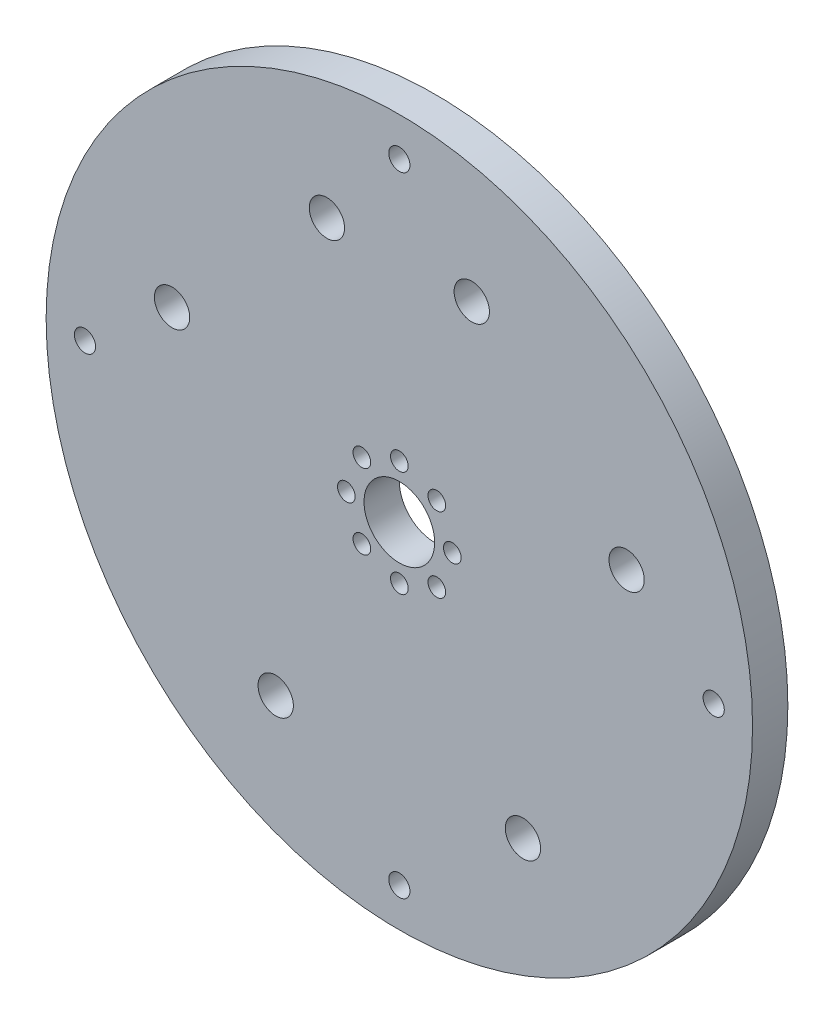
ISO-10303-21;
HEADER;
FILE_DESCRIPTION(('STEP AP214'),'2;1');
FILE_NAME('part.step','',(''),(''),'','','');
FILE_SCHEMA(('AUTOMOTIVE_DESIGN { 1 0 10303 214 1 1 1 1 }'));
ENDSEC;
DATA;
#1=APPLICATION_CONTEXT('core data for automotive mechanical design processes');
#2=APPLICATION_PROTOCOL_DEFINITION('international standard','automotive_design',2000,#1);
#3=PRODUCT_CONTEXT('',#1,'mechanical');
#4=PRODUCT('Part','Part','',(#3));
#5=PRODUCT_RELATED_PRODUCT_CATEGORY('part','',(#4));
#6=PRODUCT_DEFINITION_FORMATION('','',#4);
#7=PRODUCT_DEFINITION_CONTEXT('part definition',#1,'design');
#8=PRODUCT_DEFINITION('design','',#6,#7);
#9=PRODUCT_DEFINITION_SHAPE('','',#8);
#10=(LENGTH_UNIT() NAMED_UNIT(*) SI_UNIT(.MILLI.,.METRE.));
#11=(NAMED_UNIT(*) PLANE_ANGLE_UNIT() SI_UNIT($,.RADIAN.));
#12=(NAMED_UNIT(*) SI_UNIT($,.STERADIAN.) SOLID_ANGLE_UNIT());
#13=UNCERTAINTY_MEASURE_WITH_UNIT(LENGTH_MEASURE(1.E-05),#10,'distance_accuracy_value','');
#14=(GEOMETRIC_REPRESENTATION_CONTEXT(3) GLOBAL_UNCERTAINTY_ASSIGNED_CONTEXT((#13)) GLOBAL_UNIT_ASSIGNED_CONTEXT((#10,
#11,#12)) REPRESENTATION_CONTEXT('',''));
#15=CARTESIAN_POINT('',(0.,0.,0.));
#16=DIRECTION('',(0.,0.,1.));
#17=DIRECTION('',(1.,0.,0.));
#18=AXIS2_PLACEMENT_3D('',#15,#16,#17);
#19=CARTESIAN_POINT('',(0.,0.,5.));
#20=DIRECTION('',(0.,0.,1.));
#21=DIRECTION('',(1.,0.,0.));
#22=AXIS2_PLACEMENT_3D('',#19,#20,#21);
#23=PLANE('',#22);
#24=CARTESIAN_POINT('',(-17.5,-30.,5.));
#25=DIRECTION('',(0.,0.,1.));
#26=DIRECTION('',(1.,0.,0.));
#27=AXIS2_PLACEMENT_3D('',#24,#25,#26);
#28=CIRCLE('',#27,2.5);
#29=CARTESIAN_POINT('',(-15.,-30.,5.));
#30=VERTEX_POINT('',#29);
#31=EDGE_CURVE('E152',#30,#30,#28,.T.);
#32=ORIENTED_EDGE('',*,*,#31,.F.);
#33=EDGE_LOOP('',(#32));
#34=FACE_BOUND('',#33,.T.);
#35=CARTESIAN_POINT('',(10.2530483272049,32.1733585439879,5.));
#36=DIRECTION('',(0.,0.,1.));
#37=DIRECTION('',(-1.,0.,0.));
#38=AXIS2_PLACEMENT_3D('',#35,#36,#37);
#39=CIRCLE('',#38,2.5);
#40=CARTESIAN_POINT('',(7.75304832720494,32.1733585439879,5.));
#41=VERTEX_POINT('',#40);
#42=EDGE_CURVE('E140',#41,#41,#39,.T.);
#43=ORIENTED_EDGE('',*,*,#42,.F.);
#44=EDGE_LOOP('',(#43));
#45=FACE_BOUND('',#44,.T.);
#46=CARTESIAN_POINT('',(-10.2530483272049,32.1733585439879,5.));
#47=DIRECTION('',(0.,0.,1.));
#48=DIRECTION('',(1.,0.,0.));
#49=AXIS2_PLACEMENT_3D('',#46,#47,#48);
#50=CIRCLE('',#49,2.5);
#51=CARTESIAN_POINT('',(-7.75304832720494,32.1733585439879,5.));
#52=VERTEX_POINT('',#51);
#53=EDGE_CURVE('E128',#52,#52,#50,.T.);
#54=ORIENTED_EDGE('',*,*,#53,.F.);
#55=EDGE_LOOP('',(#54));
#56=FACE_BOUND('',#55,.T.);
#57=CARTESIAN_POINT('',(-7.5,0.,5.));
#58=DIRECTION('',(0.,0.,1.));
#59=DIRECTION('',(1.,0.,0.));
#60=AXIS2_PLACEMENT_3D('',#57,#58,#59);
#61=CIRCLE('',#60,1.25);
#62=CARTESIAN_POINT('',(-6.25,0.,5.));
#63=VERTEX_POINT('',#62);
#64=EDGE_CURVE('E116',#63,#63,#61,.T.);
#65=ORIENTED_EDGE('',*,*,#64,.F.);
#66=EDGE_LOOP('',(#65));
#67=FACE_BOUND('',#66,.T.);
#68=CARTESIAN_POINT('',(1.2762214690701E-12,-7.5,5.));
#69=DIRECTION('',(0.,0.,1.));
#70=DIRECTION('',(1.,0.,0.));
#71=AXIS2_PLACEMENT_3D('',#68,#69,#70);
#72=CIRCLE('',#71,1.25000000000127);
#73=CARTESIAN_POINT('',(1.25000000000255,-7.5,5.));
#74=VERTEX_POINT('',#73);
#75=EDGE_CURVE('E104',#74,#74,#72,.T.);
#76=ORIENTED_EDGE('',*,*,#75,.F.);
#77=EDGE_LOOP('',(#76));
#78=FACE_BOUND('',#77,.T.);
#79=CARTESIAN_POINT('',(7.5,0.,5.));
#80=DIRECTION('',(0.,0.,1.));
#81=DIRECTION('',(1.,0.,0.));
#82=AXIS2_PLACEMENT_3D('',#79,#80,#81);
#83=CIRCLE('',#82,1.25);
#84=CARTESIAN_POINT('',(8.75,0.,5.));
#85=VERTEX_POINT('',#84);
#86=EDGE_CURVE('E92',#85,#85,#83,.T.);
#87=ORIENTED_EDGE('',*,*,#86,.F.);
#88=EDGE_LOOP('',(#87));
#89=FACE_BOUND('',#88,.T.);
#90=CARTESIAN_POINT('',(0.,0.,5.));
#91=DIRECTION('',(0.,0.,1.));
#92=DIRECTION('',(1.,0.,0.));
#93=AXIS2_PLACEMENT_3D('',#90,#91,#92);
#94=CIRCLE('',#93,5.);
#95=CARTESIAN_POINT('',(5.,0.,5.));
#96=VERTEX_POINT('',#95);
#97=EDGE_CURVE('E80',#96,#96,#94,.T.);
#98=ORIENTED_EDGE('',*,*,#97,.F.);
#99=EDGE_LOOP('',(#98));
#100=FACE_BOUND('',#99,.T.);
#101=CARTESIAN_POINT('',(2.51318310453734E-12,-44.5,5.));
#102=DIRECTION('',(0.,0.,1.));
#103=DIRECTION('',(1.,0.,0.));
#104=AXIS2_PLACEMENT_3D('',#101,#102,#103);
#105=CIRCLE('',#104,1.5000000000027);
#106=CARTESIAN_POINT('',(1.50000000000522,-44.5,5.));
#107=VERTEX_POINT('',#106);
#108=EDGE_CURVE('E68',#107,#107,#105,.T.);
#109=ORIENTED_EDGE('',*,*,#108,.F.);
#110=EDGE_LOOP('',(#109));
#111=FACE_BOUND('',#110,.T.);
#112=CARTESIAN_POINT('',(0.,7.5,5.));
#113=DIRECTION('',(0.,0.,1.));
#114=DIRECTION('',(1.,0.,0.));
#115=AXIS2_PLACEMENT_3D('',#112,#113,#114);
#116=CIRCLE('',#115,1.25);
#117=CARTESIAN_POINT('',(1.25,7.5,5.));
#118=VERTEX_POINT('',#117);
#119=EDGE_CURVE('E56',#118,#118,#116,.T.);
#120=ORIENTED_EDGE('',*,*,#119,.F.);
#121=EDGE_LOOP('',(#120));
#122=FACE_BOUND('',#121,.T.);
#123=CARTESIAN_POINT('',(0.,0.,5.));
#124=DIRECTION('',(0.,0.,1.));
#125=DIRECTION('',(1.,0.,0.));
#126=AXIS2_PLACEMENT_3D('',#123,#124,#125);
#127=CIRCLE('',#126,50.);
#128=CARTESIAN_POINT('',(50.,0.,5.));
#129=VERTEX_POINT('',#128);
#130=EDGE_CURVE('E10',#129,#129,#127,.T.);
#131=ORIENTED_EDGE('',*,*,#130,.T.);
#132=EDGE_LOOP('',(#131));
#133=FACE_BOUND('',#132,.T.);
#134=CARTESIAN_POINT('',(0.,44.5,5.));
#135=DIRECTION('',(0.,0.,1.));
#136=DIRECTION('',(1.,0.,0.));
#137=AXIS2_PLACEMENT_3D('',#134,#135,#136);
#138=CIRCLE('',#137,1.5);
#139=CARTESIAN_POINT('',(1.5,44.5,5.));
#140=VERTEX_POINT('',#139);
#141=EDGE_CURVE('E51',#140,#140,#138,.T.);
#142=ORIENTED_EDGE('',*,*,#141,.F.);
#143=EDGE_LOOP('',(#142));
#144=FACE_BOUND('',#143,.T.);
#145=CARTESIAN_POINT('',(44.5000000000012,1.25659155226867E-12,5.));
#146=DIRECTION('',(0.,0.,1.));
#147=DIRECTION('',(1.,0.,0.));
#148=AXIS2_PLACEMENT_3D('',#145,#146,#147);
#149=CIRCLE('',#148,1.50000000000099);
#150=CARTESIAN_POINT('',(46.0000000000022,1.25659155226867E-12,5.));
#151=VERTEX_POINT('',#150);
#152=EDGE_CURVE('E62',#151,#151,#149,.T.);
#153=ORIENTED_EDGE('',*,*,#152,.F.);
#154=EDGE_LOOP('',(#153));
#155=FACE_BOUND('',#154,.T.);
#156=CARTESIAN_POINT('',(-44.4999999999987,-1.26204123052488E-12,5.));
#157=DIRECTION('',(0.,0.,1.));
#158=DIRECTION('',(1.,0.,0.));
#159=AXIS2_PLACEMENT_3D('',#156,#157,#158);
#160=CIRCLE('',#159,1.50000000000202);
#161=CARTESIAN_POINT('',(-42.9999999999967,-1.26204123052488E-12,5.));
#162=VERTEX_POINT('',#161);
#163=EDGE_CURVE('E74',#162,#162,#160,.T.);
#164=ORIENTED_EDGE('',*,*,#163,.F.);
#165=EDGE_LOOP('',(#164));
#166=FACE_BOUND('',#165,.T.);
#167=CARTESIAN_POINT('',(5.30330085889912,5.3033008588991,5.));
#168=DIRECTION('',(0.,0.,1.));
#169=DIRECTION('',(1.,0.,0.));
#170=AXIS2_PLACEMENT_3D('',#167,#168,#169);
#171=CIRCLE('',#170,1.25);
#172=CARTESIAN_POINT('',(6.55330085889912,5.3033008588991,5.));
#173=VERTEX_POINT('',#172);
#174=EDGE_CURVE('E86',#173,#173,#171,.T.);
#175=ORIENTED_EDGE('',*,*,#174,.F.);
#176=EDGE_LOOP('',(#175));
#177=FACE_BOUND('',#176,.T.);
#178=CARTESIAN_POINT('',(5.3033008589002,-5.30330085889865,5.));
#179=DIRECTION('',(0.,0.,1.));
#180=DIRECTION('',(1.,0.,0.));
#181=AXIS2_PLACEMENT_3D('',#178,#179,#180);
#182=CIRCLE('',#181,1.25000000000095);
#183=CARTESIAN_POINT('',(6.55330085890114,-5.30330085889865,5.));
#184=VERTEX_POINT('',#183);
#185=EDGE_CURVE('E98',#184,#184,#182,.T.);
#186=ORIENTED_EDGE('',*,*,#185,.F.);
#187=EDGE_LOOP('',(#186));
#188=FACE_BOUND('',#187,.T.);
#189=CARTESIAN_POINT('',(-5.30330085889802,-5.30330085889956,5.));
#190=DIRECTION('',(0.,0.,1.));
#191=DIRECTION('',(1.,0.,0.));
#192=AXIS2_PLACEMENT_3D('',#189,#190,#191);
#193=CIRCLE('',#192,1.25000000000124);
#194=CARTESIAN_POINT('',(-4.05330085889678,-5.30330085889956,5.));
#195=VERTEX_POINT('',#194);
#196=EDGE_CURVE('E110',#195,#195,#193,.T.);
#197=ORIENTED_EDGE('',*,*,#196,.F.);
#198=EDGE_LOOP('',(#197));
#199=FACE_BOUND('',#198,.T.);
#200=CARTESIAN_POINT('',(-5.30330085889904,5.30330085889917,5.));
#201=DIRECTION('',(0.,0.,1.));
#202=DIRECTION('',(1.,0.,0.));
#203=AXIS2_PLACEMENT_3D('',#200,#201,#202);
#204=CIRCLE('',#203,1.25);
#205=CARTESIAN_POINT('',(-4.05330085889904,5.30330085889917,5.));
#206=VERTEX_POINT('',#205);
#207=EDGE_CURVE('E122',#206,#206,#204,.T.);
#208=ORIENTED_EDGE('',*,*,#207,.F.);
#209=EDGE_LOOP('',(#208));
#210=FACE_BOUND('',#209,.T.);
#211=CARTESIAN_POINT('',(-32.1733585439879,10.2530483272049,5.));
#212=DIRECTION('',(0.,0.,1.));
#213=DIRECTION('',(1.,0.,0.));
#214=AXIS2_PLACEMENT_3D('',#211,#212,#213);
#215=CIRCLE('',#214,2.5);
#216=CARTESIAN_POINT('',(-29.6733585439879,10.2530483272049,5.));
#217=VERTEX_POINT('',#216);
#218=EDGE_CURVE('E134',#217,#217,#215,.T.);
#219=ORIENTED_EDGE('',*,*,#218,.F.);
#220=EDGE_LOOP('',(#219));
#221=FACE_BOUND('',#220,.T.);
#222=CARTESIAN_POINT('',(32.1733585439879,10.2530483272049,5.));
#223=DIRECTION('',(0.,0.,1.));
#224=DIRECTION('',(-1.,0.,0.));
#225=AXIS2_PLACEMENT_3D('',#222,#223,#224);
#226=CIRCLE('',#225,2.5);
#227=CARTESIAN_POINT('',(29.6733585439879,10.2530483272049,5.));
#228=VERTEX_POINT('',#227);
#229=EDGE_CURVE('E146',#228,#228,#226,.T.);
#230=ORIENTED_EDGE('',*,*,#229,.F.);
#231=EDGE_LOOP('',(#230));
#232=FACE_BOUND('',#231,.T.);
#233=CARTESIAN_POINT('',(17.5,-30.,5.));
#234=DIRECTION('',(0.,0.,1.));
#235=DIRECTION('',(1.,0.,0.));
#236=AXIS2_PLACEMENT_3D('',#233,#234,#235);
#237=CIRCLE('',#236,2.5);
#238=CARTESIAN_POINT('',(20.,-30.,5.));
#239=VERTEX_POINT('',#238);
#240=EDGE_CURVE('E158',#239,#239,#237,.T.);
#241=ORIENTED_EDGE('',*,*,#240,.F.);
#242=EDGE_LOOP('',(#241));
#243=FACE_BOUND('',#242,.T.);
#244=ADVANCED_FACE('F40',(#34,#45,#56,#67,#78,#89,#100,#111,#122,#133,#144,#155,#166,#177,#188,
#199,#210,#221,#232,#243),#23,.T.);
#245=CARTESIAN_POINT('',(0.,0.,0.));
#246=DIRECTION('',(0.,0.,1.));
#247=DIRECTION('',(1.,0.,0.));
#248=AXIS2_PLACEMENT_3D('',#245,#246,#247);
#249=PLANE('',#248);
#250=CARTESIAN_POINT('',(0.,0.,0.));
#251=DIRECTION('',(0.,0.,1.));
#252=DIRECTION('',(1.,0.,0.));
#253=AXIS2_PLACEMENT_3D('',#250,#251,#252);
#254=CIRCLE('',#253,50.);
#255=CARTESIAN_POINT('',(50.,0.,0.));
#256=VERTEX_POINT('',#255);
#257=EDGE_CURVE('E44',#256,#256,#254,.T.);
#258=ORIENTED_EDGE('',*,*,#257,.F.);
#259=EDGE_LOOP('',(#258));
#260=FACE_BOUND('',#259,.T.);
#261=CARTESIAN_POINT('',(0.,44.5,0.));
#262=DIRECTION('',(0.,0.,1.));
#263=DIRECTION('',(1.,0.,0.));
#264=AXIS2_PLACEMENT_3D('',#261,#262,#263);
#265=CIRCLE('',#264,1.5);
#266=CARTESIAN_POINT('',(1.5,44.5,0.));
#267=VERTEX_POINT('',#266);
#268=EDGE_CURVE('E53',#267,#267,#265,.T.);
#269=ORIENTED_EDGE('',*,*,#268,.T.);
#270=EDGE_LOOP('',(#269));
#271=FACE_BOUND('',#270,.T.);
#272=CARTESIAN_POINT('',(0.,7.5,0.));
#273=DIRECTION('',(0.,0.,1.));
#274=DIRECTION('',(1.,0.,0.));
#275=AXIS2_PLACEMENT_3D('',#272,#273,#274);
#276=CIRCLE('',#275,1.25);
#277=CARTESIAN_POINT('',(1.25,7.5,0.));
#278=VERTEX_POINT('',#277);
#279=EDGE_CURVE('E59',#278,#278,#276,.T.);
#280=ORIENTED_EDGE('',*,*,#279,.T.);
#281=EDGE_LOOP('',(#280));
#282=FACE_BOUND('',#281,.T.);
#283=CARTESIAN_POINT('',(44.5000000000012,1.25659155226867E-12,0.));
#284=DIRECTION('',(0.,0.,1.));
#285=DIRECTION('',(1.,0.,0.));
#286=AXIS2_PLACEMENT_3D('',#283,#284,#285);
#287=CIRCLE('',#286,1.50000000000099);
#288=CARTESIAN_POINT('',(46.0000000000022,1.25659155226867E-12,0.));
#289=VERTEX_POINT('',#288);
#290=EDGE_CURVE('E65',#289,#289,#287,.T.);
#291=ORIENTED_EDGE('',*,*,#290,.T.);
#292=EDGE_LOOP('',(#291));
#293=FACE_BOUND('',#292,.T.);
#294=CARTESIAN_POINT('',(2.51318310453734E-12,-44.5,0.));
#295=DIRECTION('',(0.,0.,1.));
#296=DIRECTION('',(1.,0.,0.));
#297=AXIS2_PLACEMENT_3D('',#294,#295,#296);
#298=CIRCLE('',#297,1.5000000000027);
#299=CARTESIAN_POINT('',(1.50000000000522,-44.5,0.));
#300=VERTEX_POINT('',#299);
#301=EDGE_CURVE('E71',#300,#300,#298,.T.);
#302=ORIENTED_EDGE('',*,*,#301,.T.);
#303=EDGE_LOOP('',(#302));
#304=FACE_BOUND('',#303,.T.);
#305=CARTESIAN_POINT('',(-44.4999999999987,-1.26204123052488E-12,0.));
#306=DIRECTION('',(0.,0.,1.));
#307=DIRECTION('',(1.,0.,0.));
#308=AXIS2_PLACEMENT_3D('',#305,#306,#307);
#309=CIRCLE('',#308,1.50000000000202);
#310=CARTESIAN_POINT('',(-42.9999999999967,-1.26204123052488E-12,0.));
#311=VERTEX_POINT('',#310);
#312=EDGE_CURVE('E77',#311,#311,#309,.T.);
#313=ORIENTED_EDGE('',*,*,#312,.T.);
#314=EDGE_LOOP('',(#313));
#315=FACE_BOUND('',#314,.T.);
#316=CARTESIAN_POINT('',(0.,0.,0.));
#317=DIRECTION('',(0.,0.,1.));
#318=DIRECTION('',(1.,0.,0.));
#319=AXIS2_PLACEMENT_3D('',#316,#317,#318);
#320=CIRCLE('',#319,5.);
#321=CARTESIAN_POINT('',(5.,0.,0.));
#322=VERTEX_POINT('',#321);
#323=EDGE_CURVE('E83',#322,#322,#320,.T.);
#324=ORIENTED_EDGE('',*,*,#323,.T.);
#325=EDGE_LOOP('',(#324));
#326=FACE_BOUND('',#325,.T.);
#327=CARTESIAN_POINT('',(5.30330085889912,5.3033008588991,0.));
#328=DIRECTION('',(0.,0.,1.));
#329=DIRECTION('',(1.,0.,0.));
#330=AXIS2_PLACEMENT_3D('',#327,#328,#329);
#331=CIRCLE('',#330,1.25);
#332=CARTESIAN_POINT('',(6.55330085889912,5.3033008588991,0.));
#333=VERTEX_POINT('',#332);
#334=EDGE_CURVE('E89',#333,#333,#331,.T.);
#335=ORIENTED_EDGE('',*,*,#334,.T.);
#336=EDGE_LOOP('',(#335));
#337=FACE_BOUND('',#336,.T.);
#338=CARTESIAN_POINT('',(7.5,0.,0.));
#339=DIRECTION('',(0.,0.,1.));
#340=DIRECTION('',(1.,0.,0.));
#341=AXIS2_PLACEMENT_3D('',#338,#339,#340);
#342=CIRCLE('',#341,1.25);
#343=CARTESIAN_POINT('',(8.75,0.,0.));
#344=VERTEX_POINT('',#343);
#345=EDGE_CURVE('E95',#344,#344,#342,.T.);
#346=ORIENTED_EDGE('',*,*,#345,.T.);
#347=EDGE_LOOP('',(#346));
#348=FACE_BOUND('',#347,.T.);
#349=CARTESIAN_POINT('',(5.3033008589002,-5.30330085889865,0.));
#350=DIRECTION('',(0.,0.,1.));
#351=DIRECTION('',(1.,0.,0.));
#352=AXIS2_PLACEMENT_3D('',#349,#350,#351);
#353=CIRCLE('',#352,1.25000000000095);
#354=CARTESIAN_POINT('',(6.55330085890114,-5.30330085889865,0.));
#355=VERTEX_POINT('',#354);
#356=EDGE_CURVE('E101',#355,#355,#353,.T.);
#357=ORIENTED_EDGE('',*,*,#356,.T.);
#358=EDGE_LOOP('',(#357));
#359=FACE_BOUND('',#358,.T.);
#360=CARTESIAN_POINT('',(1.2762214690701E-12,-7.5,0.));
#361=DIRECTION('',(0.,0.,1.));
#362=DIRECTION('',(1.,0.,0.));
#363=AXIS2_PLACEMENT_3D('',#360,#361,#362);
#364=CIRCLE('',#363,1.25000000000127);
#365=CARTESIAN_POINT('',(1.25000000000255,-7.5,0.));
#366=VERTEX_POINT('',#365);
#367=EDGE_CURVE('E107',#366,#366,#364,.T.);
#368=ORIENTED_EDGE('',*,*,#367,.T.);
#369=EDGE_LOOP('',(#368));
#370=FACE_BOUND('',#369,.T.);
#371=CARTESIAN_POINT('',(-5.30330085889802,-5.30330085889956,0.));
#372=DIRECTION('',(0.,0.,1.));
#373=DIRECTION('',(1.,0.,0.));
#374=AXIS2_PLACEMENT_3D('',#371,#372,#373);
#375=CIRCLE('',#374,1.25000000000124);
#376=CARTESIAN_POINT('',(-4.05330085889678,-5.30330085889956,0.));
#377=VERTEX_POINT('',#376);
#378=EDGE_CURVE('E113',#377,#377,#375,.T.);
#379=ORIENTED_EDGE('',*,*,#378,.T.);
#380=EDGE_LOOP('',(#379));
#381=FACE_BOUND('',#380,.T.);
#382=CARTESIAN_POINT('',(-7.5,0.,0.));
#383=DIRECTION('',(0.,0.,1.));
#384=DIRECTION('',(1.,0.,0.));
#385=AXIS2_PLACEMENT_3D('',#382,#383,#384);
#386=CIRCLE('',#385,1.25);
#387=CARTESIAN_POINT('',(-6.25,0.,0.));
#388=VERTEX_POINT('',#387);
#389=EDGE_CURVE('E119',#388,#388,#386,.T.);
#390=ORIENTED_EDGE('',*,*,#389,.T.);
#391=EDGE_LOOP('',(#390));
#392=FACE_BOUND('',#391,.T.);
#393=CARTESIAN_POINT('',(-5.30330085889904,5.30330085889917,0.));
#394=DIRECTION('',(0.,0.,1.));
#395=DIRECTION('',(1.,0.,0.));
#396=AXIS2_PLACEMENT_3D('',#393,#394,#395);
#397=CIRCLE('',#396,1.25);
#398=CARTESIAN_POINT('',(-4.05330085889904,5.30330085889917,0.));
#399=VERTEX_POINT('',#398);
#400=EDGE_CURVE('E125',#399,#399,#397,.T.);
#401=ORIENTED_EDGE('',*,*,#400,.T.);
#402=EDGE_LOOP('',(#401));
#403=FACE_BOUND('',#402,.T.);
#404=CARTESIAN_POINT('',(-10.2530483272049,32.1733585439879,0.));
#405=DIRECTION('',(0.,0.,1.));
#406=DIRECTION('',(1.,0.,0.));
#407=AXIS2_PLACEMENT_3D('',#404,#405,#406);
#408=CIRCLE('',#407,2.5);
#409=CARTESIAN_POINT('',(-7.75304832720494,32.1733585439879,0.));
#410=VERTEX_POINT('',#409);
#411=EDGE_CURVE('E131',#410,#410,#408,.T.);
#412=ORIENTED_EDGE('',*,*,#411,.T.);
#413=EDGE_LOOP('',(#412));
#414=FACE_BOUND('',#413,.T.);
#415=CARTESIAN_POINT('',(-32.1733585439879,10.2530483272049,0.));
#416=DIRECTION('',(0.,0.,1.));
#417=DIRECTION('',(1.,0.,0.));
#418=AXIS2_PLACEMENT_3D('',#415,#416,#417);
#419=CIRCLE('',#418,2.5);
#420=CARTESIAN_POINT('',(-29.6733585439879,10.2530483272049,0.));
#421=VERTEX_POINT('',#420);
#422=EDGE_CURVE('E137',#421,#421,#419,.T.);
#423=ORIENTED_EDGE('',*,*,#422,.T.);
#424=EDGE_LOOP('',(#423));
#425=FACE_BOUND('',#424,.T.);
#426=CARTESIAN_POINT('',(10.2530483272049,32.1733585439879,0.));
#427=DIRECTION('',(0.,0.,1.));
#428=DIRECTION('',(-1.,0.,0.));
#429=AXIS2_PLACEMENT_3D('',#426,#427,#428);
#430=CIRCLE('',#429,2.5);
#431=CARTESIAN_POINT('',(7.75304832720494,32.1733585439879,0.));
#432=VERTEX_POINT('',#431);
#433=EDGE_CURVE('E143',#432,#432,#430,.T.);
#434=ORIENTED_EDGE('',*,*,#433,.T.);
#435=EDGE_LOOP('',(#434));
#436=FACE_BOUND('',#435,.T.);
#437=CARTESIAN_POINT('',(32.1733585439879,10.2530483272049,0.));
#438=DIRECTION('',(0.,0.,1.));
#439=DIRECTION('',(-1.,0.,0.));
#440=AXIS2_PLACEMENT_3D('',#437,#438,#439);
#441=CIRCLE('',#440,2.5);
#442=CARTESIAN_POINT('',(29.6733585439879,10.2530483272049,0.));
#443=VERTEX_POINT('',#442);
#444=EDGE_CURVE('E149',#443,#443,#441,.T.);
#445=ORIENTED_EDGE('',*,*,#444,.T.);
#446=EDGE_LOOP('',(#445));
#447=FACE_BOUND('',#446,.T.);
#448=CARTESIAN_POINT('',(-17.5,-30.,0.));
#449=DIRECTION('',(0.,0.,1.));
#450=DIRECTION('',(1.,0.,0.));
#451=AXIS2_PLACEMENT_3D('',#448,#449,#450);
#452=CIRCLE('',#451,2.5);
#453=CARTESIAN_POINT('',(-15.,-30.,0.));
#454=VERTEX_POINT('',#453);
#455=EDGE_CURVE('E155',#454,#454,#452,.T.);
#456=ORIENTED_EDGE('',*,*,#455,.T.);
#457=EDGE_LOOP('',(#456));
#458=FACE_BOUND('',#457,.T.);
#459=CARTESIAN_POINT('',(17.5,-30.,0.));
#460=DIRECTION('',(0.,0.,1.));
#461=DIRECTION('',(1.,0.,0.));
#462=AXIS2_PLACEMENT_3D('',#459,#460,#461);
#463=CIRCLE('',#462,2.5);
#464=CARTESIAN_POINT('',(20.,-30.,0.));
#465=VERTEX_POINT('',#464);
#466=EDGE_CURVE('E161',#465,#465,#463,.T.);
#467=ORIENTED_EDGE('',*,*,#466,.T.);
#468=EDGE_LOOP('',(#467));
#469=FACE_BOUND('',#468,.T.);
#470=ADVANCED_FACE('F171',(#260,#271,#282,#293,#304,#315,#326,#337,#348,#359,#370,#381,#392,
#403,#414,#425,#436,#447,#458,#469),#249,.F.);
#471=CARTESIAN_POINT('',(0.,0.,5.));
#472=DIRECTION('',(0.,0.,-1.));
#473=DIRECTION('',(-1.,0.,0.));
#474=AXIS2_PLACEMENT_3D('',#471,#472,#473);
#475=CYLINDRICAL_SURFACE('',#474,50.);
#476=ORIENTED_EDGE('',*,*,#130,.F.);
#477=EDGE_LOOP('',(#476));
#478=FACE_BOUND('',#477,.T.);
#479=ORIENTED_EDGE('',*,*,#257,.T.);
#480=EDGE_LOOP('',(#479));
#481=FACE_BOUND('',#480,.T.);
#482=ADVANCED_FACE('F42',(#478,#481),#475,.T.);
#483=CARTESIAN_POINT('',(0.,44.5,5.));
#484=DIRECTION('',(0.,0.,-1.));
#485=DIRECTION('',(-1.,0.,0.));
#486=AXIS2_PLACEMENT_3D('',#483,#484,#485);
#487=CYLINDRICAL_SURFACE('',#486,1.5);
#488=ORIENTED_EDGE('',*,*,#141,.T.);
#489=EDGE_LOOP('',(#488));
#490=FACE_BOUND('',#489,.T.);
#491=ORIENTED_EDGE('',*,*,#268,.F.);
#492=EDGE_LOOP('',(#491));
#493=FACE_BOUND('',#492,.T.);
#494=ADVANCED_FACE('F181',(#490,#493),#487,.F.);
#495=CARTESIAN_POINT('',(0.,7.5,5.));
#496=DIRECTION('',(0.,0.,-1.));
#497=DIRECTION('',(-1.,0.,0.));
#498=AXIS2_PLACEMENT_3D('',#495,#496,#497);
#499=CYLINDRICAL_SURFACE('',#498,1.25);
#500=ORIENTED_EDGE('',*,*,#119,.T.);
#501=EDGE_LOOP('',(#500));
#502=FACE_BOUND('',#501,.T.);
#503=ORIENTED_EDGE('',*,*,#279,.F.);
#504=EDGE_LOOP('',(#503));
#505=FACE_BOUND('',#504,.T.);
#506=ADVANCED_FACE('F184',(#502,#505),#499,.F.);
#507=CARTESIAN_POINT('',(44.5000000000012,1.25659155226867E-12,5.));
#508=DIRECTION('',(0.,0.,-1.));
#509=DIRECTION('',(-1.,0.,0.));
#510=AXIS2_PLACEMENT_3D('',#507,#508,#509);
#511=CYLINDRICAL_SURFACE('',#510,1.50000000000099);
#512=ORIENTED_EDGE('',*,*,#152,.T.);
#513=EDGE_LOOP('',(#512));
#514=FACE_BOUND('',#513,.T.);
#515=ORIENTED_EDGE('',*,*,#290,.F.);
#516=EDGE_LOOP('',(#515));
#517=FACE_BOUND('',#516,.T.);
#518=ADVANCED_FACE('F188',(#514,#517),#511,.F.);
#519=CARTESIAN_POINT('',(2.51318310453734E-12,-44.5,5.));
#520=DIRECTION('',(0.,0.,-1.));
#521=DIRECTION('',(-1.,0.,0.));
#522=AXIS2_PLACEMENT_3D('',#519,#520,#521);
#523=CYLINDRICAL_SURFACE('',#522,1.5000000000027);
#524=ORIENTED_EDGE('',*,*,#108,.T.);
#525=EDGE_LOOP('',(#524));
#526=FACE_BOUND('',#525,.T.);
#527=ORIENTED_EDGE('',*,*,#301,.F.);
#528=EDGE_LOOP('',(#527));
#529=FACE_BOUND('',#528,.T.);
#530=ADVANCED_FACE('F192',(#526,#529),#523,.F.);
#531=CARTESIAN_POINT('',(-44.4999999999987,-1.26204123052488E-12,5.));
#532=DIRECTION('',(0.,0.,-1.));
#533=DIRECTION('',(-1.,0.,0.));
#534=AXIS2_PLACEMENT_3D('',#531,#532,#533);
#535=CYLINDRICAL_SURFACE('',#534,1.50000000000202);
#536=ORIENTED_EDGE('',*,*,#163,.T.);
#537=EDGE_LOOP('',(#536));
#538=FACE_BOUND('',#537,.T.);
#539=ORIENTED_EDGE('',*,*,#312,.F.);
#540=EDGE_LOOP('',(#539));
#541=FACE_BOUND('',#540,.T.);
#542=ADVANCED_FACE('F196',(#538,#541),#535,.F.);
#543=CARTESIAN_POINT('',(0.,0.,5.));
#544=DIRECTION('',(0.,0.,-1.));
#545=DIRECTION('',(-1.,0.,0.));
#546=AXIS2_PLACEMENT_3D('',#543,#544,#545);
#547=CYLINDRICAL_SURFACE('',#546,5.);
#548=ORIENTED_EDGE('',*,*,#97,.T.);
#549=EDGE_LOOP('',(#548));
#550=FACE_BOUND('',#549,.T.);
#551=ORIENTED_EDGE('',*,*,#323,.F.);
#552=EDGE_LOOP('',(#551));
#553=FACE_BOUND('',#552,.T.);
#554=ADVANCED_FACE('F200',(#550,#553),#547,.F.);
#555=CARTESIAN_POINT('',(5.30330085889912,5.3033008588991,5.));
#556=DIRECTION('',(0.,0.,-1.));
#557=DIRECTION('',(-1.,0.,0.));
#558=AXIS2_PLACEMENT_3D('',#555,#556,#557);
#559=CYLINDRICAL_SURFACE('',#558,1.25);
#560=ORIENTED_EDGE('',*,*,#174,.T.);
#561=EDGE_LOOP('',(#560));
#562=FACE_BOUND('',#561,.T.);
#563=ORIENTED_EDGE('',*,*,#334,.F.);
#564=EDGE_LOOP('',(#563));
#565=FACE_BOUND('',#564,.T.);
#566=ADVANCED_FACE('F204',(#562,#565),#559,.F.);
#567=CARTESIAN_POINT('',(7.5,0.,5.));
#568=DIRECTION('',(0.,0.,-1.));
#569=DIRECTION('',(-1.,0.,0.));
#570=AXIS2_PLACEMENT_3D('',#567,#568,#569);
#571=CYLINDRICAL_SURFACE('',#570,1.25);
#572=ORIENTED_EDGE('',*,*,#86,.T.);
#573=EDGE_LOOP('',(#572));
#574=FACE_BOUND('',#573,.T.);
#575=ORIENTED_EDGE('',*,*,#345,.F.);
#576=EDGE_LOOP('',(#575));
#577=FACE_BOUND('',#576,.T.);
#578=ADVANCED_FACE('F208',(#574,#577),#571,.F.);
#579=CARTESIAN_POINT('',(5.3033008589002,-5.30330085889865,5.));
#580=DIRECTION('',(0.,0.,-1.));
#581=DIRECTION('',(-1.,0.,0.));
#582=AXIS2_PLACEMENT_3D('',#579,#580,#581);
#583=CYLINDRICAL_SURFACE('',#582,1.25000000000095);
#584=ORIENTED_EDGE('',*,*,#185,.T.);
#585=EDGE_LOOP('',(#584));
#586=FACE_BOUND('',#585,.T.);
#587=ORIENTED_EDGE('',*,*,#356,.F.);
#588=EDGE_LOOP('',(#587));
#589=FACE_BOUND('',#588,.T.);
#590=ADVANCED_FACE('F212',(#586,#589),#583,.F.);
#591=CARTESIAN_POINT('',(1.2762214690701E-12,-7.5,5.));
#592=DIRECTION('',(0.,0.,-1.));
#593=DIRECTION('',(-1.,0.,0.));
#594=AXIS2_PLACEMENT_3D('',#591,#592,#593);
#595=CYLINDRICAL_SURFACE('',#594,1.25000000000127);
#596=ORIENTED_EDGE('',*,*,#75,.T.);
#597=EDGE_LOOP('',(#596));
#598=FACE_BOUND('',#597,.T.);
#599=ORIENTED_EDGE('',*,*,#367,.F.);
#600=EDGE_LOOP('',(#599));
#601=FACE_BOUND('',#600,.T.);
#602=ADVANCED_FACE('F216',(#598,#601),#595,.F.);
#603=CARTESIAN_POINT('',(-5.30330085889802,-5.30330085889956,5.));
#604=DIRECTION('',(0.,0.,-1.));
#605=DIRECTION('',(-1.,0.,0.));
#606=AXIS2_PLACEMENT_3D('',#603,#604,#605);
#607=CYLINDRICAL_SURFACE('',#606,1.25000000000124);
#608=ORIENTED_EDGE('',*,*,#196,.T.);
#609=EDGE_LOOP('',(#608));
#610=FACE_BOUND('',#609,.T.);
#611=ORIENTED_EDGE('',*,*,#378,.F.);
#612=EDGE_LOOP('',(#611));
#613=FACE_BOUND('',#612,.T.);
#614=ADVANCED_FACE('F220',(#610,#613),#607,.F.);
#615=CARTESIAN_POINT('',(-7.5,0.,5.));
#616=DIRECTION('',(0.,0.,-1.));
#617=DIRECTION('',(-1.,0.,0.));
#618=AXIS2_PLACEMENT_3D('',#615,#616,#617);
#619=CYLINDRICAL_SURFACE('',#618,1.25);
#620=ORIENTED_EDGE('',*,*,#64,.T.);
#621=EDGE_LOOP('',(#620));
#622=FACE_BOUND('',#621,.T.);
#623=ORIENTED_EDGE('',*,*,#389,.F.);
#624=EDGE_LOOP('',(#623));
#625=FACE_BOUND('',#624,.T.);
#626=ADVANCED_FACE('F224',(#622,#625),#619,.F.);
#627=CARTESIAN_POINT('',(-5.30330085889904,5.30330085889917,5.));
#628=DIRECTION('',(0.,0.,-1.));
#629=DIRECTION('',(-1.,0.,0.));
#630=AXIS2_PLACEMENT_3D('',#627,#628,#629);
#631=CYLINDRICAL_SURFACE('',#630,1.25);
#632=ORIENTED_EDGE('',*,*,#207,.T.);
#633=EDGE_LOOP('',(#632));
#634=FACE_BOUND('',#633,.T.);
#635=ORIENTED_EDGE('',*,*,#400,.F.);
#636=EDGE_LOOP('',(#635));
#637=FACE_BOUND('',#636,.T.);
#638=ADVANCED_FACE('F228',(#634,#637),#631,.F.);
#639=CARTESIAN_POINT('',(-10.2530483272049,32.1733585439879,5.));
#640=DIRECTION('',(0.,0.,-1.));
#641=DIRECTION('',(-1.,0.,0.));
#642=AXIS2_PLACEMENT_3D('',#639,#640,#641);
#643=CYLINDRICAL_SURFACE('',#642,2.5);
#644=ORIENTED_EDGE('',*,*,#53,.T.);
#645=EDGE_LOOP('',(#644));
#646=FACE_BOUND('',#645,.T.);
#647=ORIENTED_EDGE('',*,*,#411,.F.);
#648=EDGE_LOOP('',(#647));
#649=FACE_BOUND('',#648,.T.);
#650=ADVANCED_FACE('F232',(#646,#649),#643,.F.);
#651=CARTESIAN_POINT('',(-32.1733585439879,10.2530483272049,5.));
#652=DIRECTION('',(0.,0.,-1.));
#653=DIRECTION('',(-1.,0.,0.));
#654=AXIS2_PLACEMENT_3D('',#651,#652,#653);
#655=CYLINDRICAL_SURFACE('',#654,2.5);
#656=ORIENTED_EDGE('',*,*,#218,.T.);
#657=EDGE_LOOP('',(#656));
#658=FACE_BOUND('',#657,.T.);
#659=ORIENTED_EDGE('',*,*,#422,.F.);
#660=EDGE_LOOP('',(#659));
#661=FACE_BOUND('',#660,.T.);
#662=ADVANCED_FACE('F236',(#658,#661),#655,.F.);
#663=CARTESIAN_POINT('',(10.2530483272049,32.1733585439879,5.));
#664=DIRECTION('',(0.,0.,-1.));
#665=DIRECTION('',(-1.,0.,0.));
#666=AXIS2_PLACEMENT_3D('',#663,#664,#665);
#667=CYLINDRICAL_SURFACE('',#666,2.5);
#668=ORIENTED_EDGE('',*,*,#42,.T.);
#669=EDGE_LOOP('',(#668));
#670=FACE_BOUND('',#669,.T.);
#671=ORIENTED_EDGE('',*,*,#433,.F.);
#672=EDGE_LOOP('',(#671));
#673=FACE_BOUND('',#672,.T.);
#674=ADVANCED_FACE('F240',(#670,#673),#667,.F.);
#675=CARTESIAN_POINT('',(32.1733585439879,10.2530483272049,5.));
#676=DIRECTION('',(0.,0.,-1.));
#677=DIRECTION('',(-1.,0.,0.));
#678=AXIS2_PLACEMENT_3D('',#675,#676,#677);
#679=CYLINDRICAL_SURFACE('',#678,2.5);
#680=ORIENTED_EDGE('',*,*,#229,.T.);
#681=EDGE_LOOP('',(#680));
#682=FACE_BOUND('',#681,.T.);
#683=ORIENTED_EDGE('',*,*,#444,.F.);
#684=EDGE_LOOP('',(#683));
#685=FACE_BOUND('',#684,.T.);
#686=ADVANCED_FACE('F244',(#682,#685),#679,.F.);
#687=CARTESIAN_POINT('',(-17.5,-30.,5.));
#688=DIRECTION('',(0.,0.,-1.));
#689=DIRECTION('',(-1.,0.,0.));
#690=AXIS2_PLACEMENT_3D('',#687,#688,#689);
#691=CYLINDRICAL_SURFACE('',#690,2.5);
#692=ORIENTED_EDGE('',*,*,#31,.T.);
#693=EDGE_LOOP('',(#692));
#694=FACE_BOUND('',#693,.T.);
#695=ORIENTED_EDGE('',*,*,#455,.F.);
#696=EDGE_LOOP('',(#695));
#697=FACE_BOUND('',#696,.T.);
#698=ADVANCED_FACE('F248',(#694,#697),#691,.F.);
#699=CARTESIAN_POINT('',(17.5,-30.,5.));
#700=DIRECTION('',(0.,0.,-1.));
#701=DIRECTION('',(-1.,0.,0.));
#702=AXIS2_PLACEMENT_3D('',#699,#700,#701);
#703=CYLINDRICAL_SURFACE('',#702,2.5);
#704=ORIENTED_EDGE('',*,*,#240,.T.);
#705=EDGE_LOOP('',(#704));
#706=FACE_BOUND('',#705,.T.);
#707=ORIENTED_EDGE('',*,*,#466,.F.);
#708=EDGE_LOOP('',(#707));
#709=FACE_BOUND('',#708,.T.);
#710=ADVANCED_FACE('F167',(#706,#709),#703,.F.);
#711=CLOSED_SHELL('',(#244,#470,#482,#494,#506,#518,#530,#542,#554,#566,#578,#590,#602,#614,
#626,#638,#650,#662,#674,#686,#698,#710));
#712=MANIFOLD_SOLID_BREP('B2',#711);
#713=ADVANCED_BREP_SHAPE_REPRESENTATION('',(#18,#712),#14);
#714=SHAPE_DEFINITION_REPRESENTATION(#9,#713);
ENDSEC;
END-ISO-10303-21;
